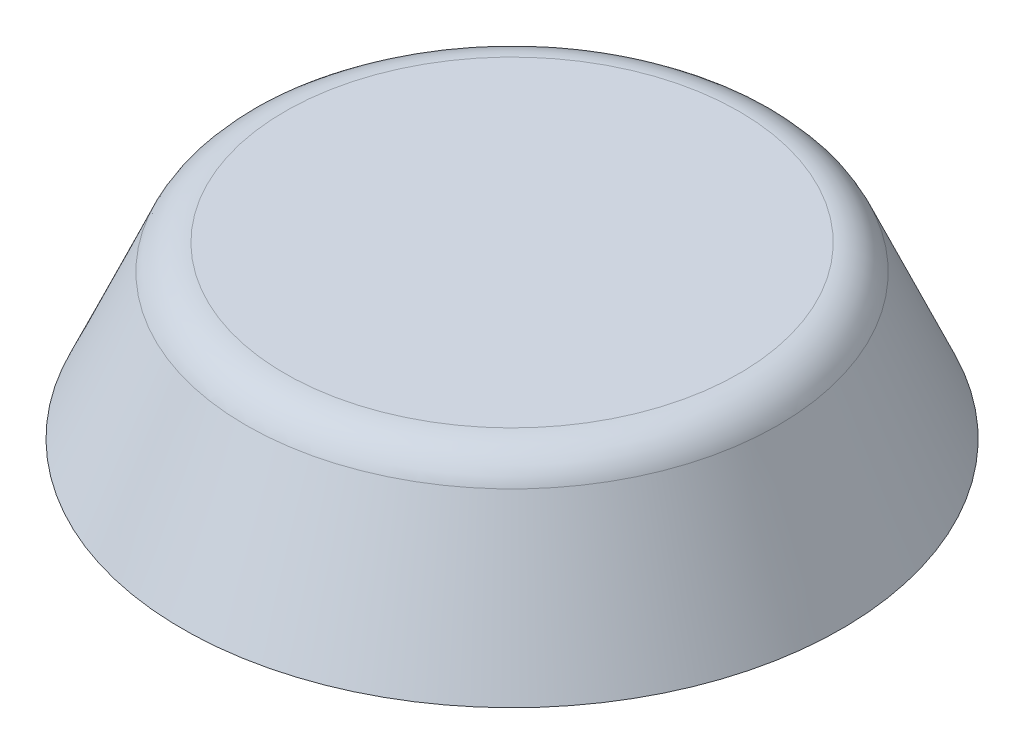
ISO-10303-21;
HEADER;
FILE_DESCRIPTION(('STEP AP214'),'2;1');
FILE_NAME('part.step','',(''),(''),'','','');
FILE_SCHEMA(('AUTOMOTIVE_DESIGN { 1 0 10303 214 1 1 1 1 }'));
ENDSEC;
DATA;
#1=APPLICATION_CONTEXT('core data for automotive mechanical design processes');
#2=APPLICATION_PROTOCOL_DEFINITION('international standard','automotive_design',2000,#1);
#3=PRODUCT_CONTEXT('',#1,'mechanical');
#4=PRODUCT('Part','Part','',(#3));
#5=PRODUCT_RELATED_PRODUCT_CATEGORY('part','',(#4));
#6=PRODUCT_DEFINITION_FORMATION('','',#4);
#7=PRODUCT_DEFINITION_CONTEXT('part definition',#1,'design');
#8=PRODUCT_DEFINITION('design','',#6,#7);
#9=PRODUCT_DEFINITION_SHAPE('','',#8);
#10=(LENGTH_UNIT() NAMED_UNIT(*) SI_UNIT(.MILLI.,.METRE.));
#11=(NAMED_UNIT(*) PLANE_ANGLE_UNIT() SI_UNIT($,.RADIAN.));
#12=(NAMED_UNIT(*) SI_UNIT($,.STERADIAN.) SOLID_ANGLE_UNIT());
#13=UNCERTAINTY_MEASURE_WITH_UNIT(LENGTH_MEASURE(1.E-05),#10,'distance_accuracy_value','');
#14=(GEOMETRIC_REPRESENTATION_CONTEXT(3) GLOBAL_UNCERTAINTY_ASSIGNED_CONTEXT((#13)) GLOBAL_UNIT_ASSIGNED_CONTEXT((#10,
#11,#12)) REPRESENTATION_CONTEXT('',''));
#15=CARTESIAN_POINT('',(0.,0.,0.));
#16=DIRECTION('',(0.,0.,1.));
#17=DIRECTION('',(1.,0.,0.));
#18=AXIS2_PLACEMENT_3D('',#15,#16,#17);
#19=CARTESIAN_POINT('',(0.,0.,0.));
#20=DIRECTION('',(0.,1.,0.));
#21=DIRECTION('',(0.,0.,1.));
#22=AXIS2_PLACEMENT_3D('',#19,#20,#21);
#23=PLANE('',#22);
#24=CARTESIAN_POINT('',(0.,0.,0.));
#25=DIRECTION('',(0.,-1.,0.));
#26=DIRECTION('',(0.,0.,-1.));
#27=AXIS2_PLACEMENT_3D('',#24,#25,#26);
#28=CIRCLE('',#27,6.1595);
#29=CARTESIAN_POINT('',(0.,0.,-6.1595));
#30=VERTEX_POINT('',#29);
#31=EDGE_CURVE('E46',#30,#30,#28,.T.);
#32=ORIENTED_EDGE('',*,*,#31,.T.);
#33=EDGE_LOOP('',(#32));
#34=FACE_BOUND('',#33,.T.);
#35=ADVANCED_FACE('F35',(#34),#23,.F.);
#36=CARTESIAN_POINT('',(0.,3.175,0.));
#37=DIRECTION('',(0.,-1.,0.));
#38=DIRECTION('',(0.,0.,-1.));
#39=AXIS2_PLACEMENT_3D('',#36,#37,#38);
#40=CONICAL_SURFACE('',#39,4.7625,0.414506874584786);
#41=CARTESIAN_POINT('',(0.,2.70092377507365,0.));
#42=DIRECTION('',(0.,1.,0.));
#43=DIRECTION('',(0.,0.,1.));
#44=AXIS2_PLACEMENT_3D('',#41,#42,#43);
#45=CIRCLE('',#44,4.97109353896759);
#46=CARTESIAN_POINT('',(0.,2.70092377507365,4.97109353896759));
#47=VERTEX_POINT('',#46);
#48=EDGE_CURVE('E42',#47,#47,#45,.F.);
#49=ORIENTED_EDGE('',*,*,#48,.T.);
#50=EDGE_LOOP('',(#49));
#51=FACE_BOUND('',#50,.T.);
#52=ORIENTED_EDGE('',*,*,#31,.F.);
#53=EDGE_LOOP('',(#52));
#54=FACE_BOUND('',#53,.T.);
#55=ADVANCED_FACE('F54',(#51,#54),#40,.T.);
#56=CARTESIAN_POINT('',(-4.7625,3.175,0.));
#57=DIRECTION('',(0.,-1.,0.));
#58=DIRECTION('',(0.,0.,-1.));
#59=AXIS2_PLACEMENT_3D('',#56,#57,#58);
#60=PLANE('',#59);
#61=CARTESIAN_POINT('',(0.,3.175,0.));
#62=DIRECTION('',(0.,-1.,0.));
#63=DIRECTION('',(0.,0.,-1.));
#64=AXIS2_PLACEMENT_3D('',#61,#62,#63);
#65=CIRCLE('',#64,4.24456223198202);
#66=CARTESIAN_POINT('',(0.,3.175,-4.24456223198202));
#67=VERTEX_POINT('',#66);
#68=EDGE_CURVE('E10',#67,#67,#65,.F.);
#69=ORIENTED_EDGE('',*,*,#68,.T.);
#70=EDGE_LOOP('',(#69));
#71=FACE_BOUND('',#70,.T.);
#72=ADVANCED_FACE('F56',(#71),#60,.F.);
#73=CARTESIAN_POINT('',(0.,2.38125,0.));
#74=DIRECTION('',(0.,-1.,0.));
#75=DIRECTION('',(0.,0.,-1.));
#76=AXIS2_PLACEMENT_3D('',#73,#74,#75);
#77=TOROIDAL_SURFACE('',#76,4.24456223198202,0.79375);
#78=ORIENTED_EDGE('',*,*,#68,.F.);
#79=EDGE_LOOP('',(#78));
#80=FACE_BOUND('',#79,.T.);
#81=ORIENTED_EDGE('',*,*,#48,.F.);
#82=EDGE_LOOP('',(#81));
#83=FACE_BOUND('',#82,.T.);
#84=ADVANCED_FACE('F37',(#80,#83),#77,.T.);
#85=CLOSED_SHELL('',(#35,#55,#72,#84));
#86=MANIFOLD_SOLID_BREP('B2',#85);
#87=ADVANCED_BREP_SHAPE_REPRESENTATION('',(#18,#86),#14);
#88=SHAPE_DEFINITION_REPRESENTATION(#9,#87);
ENDSEC;
END-ISO-10303-21;
